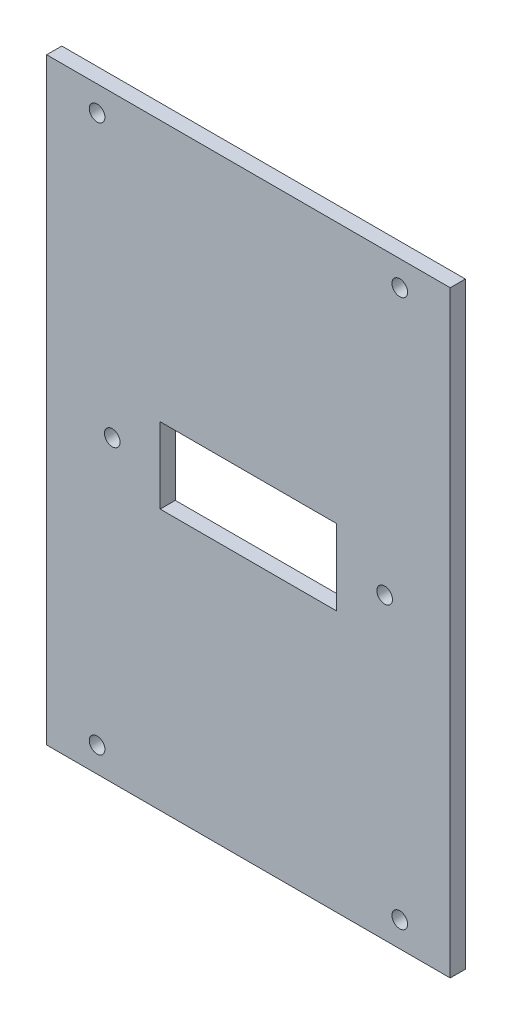
ISO-10303-21;
HEADER;
FILE_DESCRIPTION(('STEP AP214'),'2;1');
FILE_NAME('part.step','',(''),(''),'','','');
FILE_SCHEMA(('AUTOMOTIVE_DESIGN { 1 0 10303 214 1 1 1 1 }'));
ENDSEC;
DATA;
#1=APPLICATION_CONTEXT('core data for automotive mechanical design processes');
#2=APPLICATION_PROTOCOL_DEFINITION('international standard','automotive_design',2000,#1);
#3=PRODUCT_CONTEXT('',#1,'mechanical');
#4=PRODUCT('Part','Part','',(#3));
#5=PRODUCT_RELATED_PRODUCT_CATEGORY('part','',(#4));
#6=PRODUCT_DEFINITION_FORMATION('','',#4);
#7=PRODUCT_DEFINITION_CONTEXT('part definition',#1,'design');
#8=PRODUCT_DEFINITION('design','',#6,#7);
#9=PRODUCT_DEFINITION_SHAPE('','',#8);
#10=(LENGTH_UNIT() NAMED_UNIT(*) SI_UNIT(.MILLI.,.METRE.));
#11=(NAMED_UNIT(*) PLANE_ANGLE_UNIT() SI_UNIT($,.RADIAN.));
#12=(NAMED_UNIT(*) SI_UNIT($,.STERADIAN.) SOLID_ANGLE_UNIT());
#13=UNCERTAINTY_MEASURE_WITH_UNIT(LENGTH_MEASURE(1.E-05),#10,'distance_accuracy_value','');
#14=(GEOMETRIC_REPRESENTATION_CONTEXT(3) GLOBAL_UNCERTAINTY_ASSIGNED_CONTEXT((#13)) GLOBAL_UNIT_ASSIGNED_CONTEXT((#10,
#11,#12)) REPRESENTATION_CONTEXT('',''));
#15=CARTESIAN_POINT('',(0.,0.,0.));
#16=DIRECTION('',(0.,0.,1.));
#17=DIRECTION('',(1.,0.,0.));
#18=AXIS2_PLACEMENT_3D('',#15,#16,#17);
#19=CARTESIAN_POINT('',(0.,0.,3.));
#20=DIRECTION('',(0.,0.,-1.));
#21=DIRECTION('',(-1.,0.,0.));
#22=AXIS2_PLACEMENT_3D('',#19,#20,#21);
#23=PLANE('',#22);
#24=CARTESIAN_POINT('',(66.9999999999992,59.25,3.));
#25=DIRECTION('',(0.,0.,-1.));
#26=DIRECTION('',(-1.,0.,0.));
#27=AXIS2_PLACEMENT_3D('',#24,#25,#26);
#28=CIRCLE('',#27,1.55000000000001);
#29=CARTESIAN_POINT('',(65.4499999999992,59.25,3.));
#30=VERTEX_POINT('',#29);
#31=EDGE_CURVE('E253',#30,#30,#28,.F.);
#32=ORIENTED_EDGE('',*,*,#31,.F.);
#33=EDGE_LOOP('',(#32));
#34=FACE_BOUND('',#33,.T.);
#35=CARTESIAN_POINT('',(13.0000000000007,59.25,3.));
#36=DIRECTION('',(0.,0.,-1.));
#37=DIRECTION('',(-1.,0.,0.));
#38=AXIS2_PLACEMENT_3D('',#35,#36,#37);
#39=CIRCLE('',#38,1.55000000000001);
#40=CARTESIAN_POINT('',(11.4500000000007,59.25,3.));
#41=VERTEX_POINT('',#40);
#42=EDGE_CURVE('E262',#41,#41,#39,.F.);
#43=ORIENTED_EDGE('',*,*,#42,.F.);
#44=EDGE_LOOP('',(#43));
#45=FACE_BOUND('',#44,.T.);
#46=CARTESIAN_POINT('',(70.,4.99999999999998,3.));
#47=DIRECTION('',(0.,0.,1.));
#48=DIRECTION('',(1.,0.,0.));
#49=AXIS2_PLACEMENT_3D('',#46,#47,#48);
#50=CIRCLE('',#49,1.54999999999999);
#51=CARTESIAN_POINT('',(71.55,4.99999999999998,3.));
#52=VERTEX_POINT('',#51);
#53=EDGE_CURVE('E277',#52,#52,#50,.T.);
#54=ORIENTED_EDGE('',*,*,#53,.F.);
#55=EDGE_LOOP('',(#54));
#56=FACE_BOUND('',#55,.T.);
#57=CARTESIAN_POINT('',(9.99999999999997,113.5,3.));
#58=DIRECTION('',(0.,0.,1.));
#59=DIRECTION('',(1.,0.,0.));
#60=AXIS2_PLACEMENT_3D('',#57,#58,#59);
#61=CIRCLE('',#60,1.54999999999999);
#62=CARTESIAN_POINT('',(11.55,113.5,3.));
#63=VERTEX_POINT('',#62);
#64=EDGE_CURVE('E133',#63,#63,#61,.T.);
#65=ORIENTED_EDGE('',*,*,#64,.F.);
#66=EDGE_LOOP('',(#65));
#67=FACE_BOUND('',#66,.T.);
#68=DIRECTION('',(0.,-1.,0.));
#69=VECTOR('',#68,1.);
#70=CARTESIAN_POINT('',(0.,0.,3.));
#71=LINE('',#70,#69);
#72=CARTESIAN_POINT('',(0.,118.5,3.));
#73=VERTEX_POINT('',#72);
#74=CARTESIAN_POINT('',(0.,0.,3.));
#75=VERTEX_POINT('',#74);
#76=EDGE_CURVE('E143',#73,#75,#71,.T.);
#77=ORIENTED_EDGE('',*,*,#76,.T.);
#78=DIRECTION('',(1.,0.,0.));
#79=VECTOR('',#78,1.);
#80=CARTESIAN_POINT('',(0.,0.,3.));
#81=LINE('',#80,#79);
#82=CARTESIAN_POINT('',(80.,0.,3.));
#83=VERTEX_POINT('',#82);
#84=EDGE_CURVE('E146',#75,#83,#81,.T.);
#85=ORIENTED_EDGE('',*,*,#84,.T.);
#86=DIRECTION('',(0.,1.,0.));
#87=VECTOR('',#86,1.);
#88=CARTESIAN_POINT('',(80.,0.,3.));
#89=LINE('',#88,#87);
#90=CARTESIAN_POINT('',(80.,118.5,3.));
#91=VERTEX_POINT('',#90);
#92=EDGE_CURVE('E149',#83,#91,#89,.T.);
#93=ORIENTED_EDGE('',*,*,#92,.T.);
#94=DIRECTION('',(-1.,0.,0.));
#95=VECTOR('',#94,1.);
#96=CARTESIAN_POINT('',(0.,118.5,3.));
#97=LINE('',#96,#95);
#98=EDGE_CURVE('E151',#91,#73,#97,.T.);
#99=ORIENTED_EDGE('',*,*,#98,.T.);
#100=EDGE_LOOP('',(#77,#85,#93,#99));
#101=FACE_BOUND('',#100,.T.);
#102=DIRECTION('',(0.,1.,0.));
#103=VECTOR('',#102,1.);
#104=CARTESIAN_POINT('',(57.5,66.75,3.));
#105=LINE('',#104,#103);
#106=CARTESIAN_POINT('',(57.5,51.75,3.));
#107=VERTEX_POINT('',#106);
#108=CARTESIAN_POINT('',(57.5,66.75,3.));
#109=VERTEX_POINT('',#108);
#110=EDGE_CURVE('E104',#107,#109,#105,.T.);
#111=ORIENTED_EDGE('',*,*,#110,.F.);
#112=DIRECTION('',(1.,0.,0.));
#113=VECTOR('',#112,1.);
#114=CARTESIAN_POINT('',(22.5,51.75,3.));
#115=LINE('',#114,#113);
#116=CARTESIAN_POINT('',(22.5,51.75,3.));
#117=VERTEX_POINT('',#116);
#118=EDGE_CURVE('E127',#117,#107,#115,.T.);
#119=ORIENTED_EDGE('',*,*,#118,.F.);
#120=DIRECTION('',(0.,-1.,0.));
#121=VECTOR('',#120,1.);
#122=CARTESIAN_POINT('',(22.5,66.75,3.));
#123=LINE('',#122,#121);
#124=CARTESIAN_POINT('',(22.5,66.75,3.));
#125=VERTEX_POINT('',#124);
#126=EDGE_CURVE('E125',#125,#117,#123,.T.);
#127=ORIENTED_EDGE('',*,*,#126,.F.);
#128=DIRECTION('',(-1.,0.,0.));
#129=VECTOR('',#128,1.);
#130=CARTESIAN_POINT('',(22.5,66.75,3.));
#131=LINE('',#130,#129);
#132=EDGE_CURVE('E112',#109,#125,#131,.T.);
#133=ORIENTED_EDGE('',*,*,#132,.F.);
#134=EDGE_LOOP('',(#111,#119,#127,#133));
#135=FACE_BOUND('',#134,.T.);
#136=CARTESIAN_POINT('',(70.,113.5,3.));
#137=DIRECTION('',(0.,0.,-1.));
#138=DIRECTION('',(-1.,0.,0.));
#139=AXIS2_PLACEMENT_3D('',#136,#137,#138);
#140=CIRCLE('',#139,1.54999999999999);
#141=CARTESIAN_POINT('',(71.55,113.5,3.));
#142=VERTEX_POINT('',#141);
#143=EDGE_CURVE('E270',#142,#142,#140,.T.);
#144=ORIENTED_EDGE('',*,*,#143,.T.);
#145=EDGE_LOOP('',(#144));
#146=FACE_BOUND('',#145,.T.);
#147=CARTESIAN_POINT('',(9.99999999999997,4.99999999999998,3.));
#148=DIRECTION('',(0.,0.,-1.));
#149=DIRECTION('',(-1.,0.,0.));
#150=AXIS2_PLACEMENT_3D('',#147,#148,#149);
#151=CIRCLE('',#150,1.55);
#152=CARTESIAN_POINT('',(11.55,4.99999999999998,3.));
#153=VERTEX_POINT('',#152);
#154=EDGE_CURVE('E257',#153,#153,#151,.T.);
#155=ORIENTED_EDGE('',*,*,#154,.T.);
#156=EDGE_LOOP('',(#155));
#157=FACE_BOUND('',#156,.T.);
#158=ADVANCED_FACE('F39',(#34,#45,#56,#67,#101,#135,#146,#157),#23,.F.);
#159=CARTESIAN_POINT('',(0.,0.,0.));
#160=DIRECTION('',(0.,0.,-1.));
#161=DIRECTION('',(-1.,0.,0.));
#162=AXIS2_PLACEMENT_3D('',#159,#160,#161);
#163=PLANE('',#162);
#164=CARTESIAN_POINT('',(66.9999999999992,59.25,0.));
#165=DIRECTION('',(0.,0.,-1.));
#166=DIRECTION('',(-1.,0.,0.));
#167=AXIS2_PLACEMENT_3D('',#164,#165,#166);
#168=CIRCLE('',#167,1.55000000000001);
#169=CARTESIAN_POINT('',(65.4499999999992,59.25,0.));
#170=VERTEX_POINT('',#169);
#171=EDGE_CURVE('E251',#170,#170,#168,.T.);
#172=ORIENTED_EDGE('',*,*,#171,.F.);
#173=EDGE_LOOP('',(#172));
#174=FACE_BOUND('',#173,.T.);
#175=CARTESIAN_POINT('',(13.0000000000007,59.25,0.));
#176=DIRECTION('',(0.,0.,-1.));
#177=DIRECTION('',(1.,0.,0.));
#178=AXIS2_PLACEMENT_3D('',#175,#176,#177);
#179=CIRCLE('',#178,1.55000000000001);
#180=CARTESIAN_POINT('',(11.4500000000007,59.25,0.));
#181=VERTEX_POINT('',#180);
#182=EDGE_CURVE('E259',#181,#181,#179,.T.);
#183=ORIENTED_EDGE('',*,*,#182,.F.);
#184=EDGE_LOOP('',(#183));
#185=FACE_BOUND('',#184,.T.);
#186=CARTESIAN_POINT('',(70.,113.5,0.));
#187=DIRECTION('',(0.,0.,-1.));
#188=DIRECTION('',(-1.,0.,0.));
#189=AXIS2_PLACEMENT_3D('',#186,#187,#188);
#190=CIRCLE('',#189,1.54999999999999);
#191=CARTESIAN_POINT('',(71.55,113.5,0.));
#192=VERTEX_POINT('',#191);
#193=EDGE_CURVE('E267',#192,#192,#190,.T.);
#194=ORIENTED_EDGE('',*,*,#193,.F.);
#195=EDGE_LOOP('',(#194));
#196=FACE_BOUND('',#195,.T.);
#197=CARTESIAN_POINT('',(9.99999999999997,113.5,0.));
#198=DIRECTION('',(0.,0.,-1.));
#199=DIRECTION('',(-1.,0.,0.));
#200=AXIS2_PLACEMENT_3D('',#197,#198,#199);
#201=CIRCLE('',#200,1.54999999999999);
#202=CARTESIAN_POINT('',(11.55,113.5,0.));
#203=VERTEX_POINT('',#202);
#204=EDGE_CURVE('E274',#203,#203,#201,.F.);
#205=ORIENTED_EDGE('',*,*,#204,.T.);
#206=EDGE_LOOP('',(#205));
#207=FACE_BOUND('',#206,.T.);
#208=DIRECTION('',(0.,-1.,0.));
#209=VECTOR('',#208,1.);
#210=CARTESIAN_POINT('',(0.,0.,0.));
#211=LINE('',#210,#209);
#212=CARTESIAN_POINT('',(0.,118.5,0.));
#213=VERTEX_POINT('',#212);
#214=CARTESIAN_POINT('',(0.,0.,0.));
#215=VERTEX_POINT('',#214);
#216=EDGE_CURVE('E120',#213,#215,#211,.T.);
#217=ORIENTED_EDGE('',*,*,#216,.F.);
#218=DIRECTION('',(-1.,0.,0.));
#219=VECTOR('',#218,1.);
#220=CARTESIAN_POINT('',(0.,118.5,0.));
#221=LINE('',#220,#219);
#222=CARTESIAN_POINT('',(80.,118.5,0.));
#223=VERTEX_POINT('',#222);
#224=EDGE_CURVE('E147',#223,#213,#221,.T.);
#225=ORIENTED_EDGE('',*,*,#224,.F.);
#226=DIRECTION('',(0.,1.,0.));
#227=VECTOR('',#226,1.);
#228=CARTESIAN_POINT('',(80.,0.,0.));
#229=LINE('',#228,#227);
#230=CARTESIAN_POINT('',(80.,0.,0.));
#231=VERTEX_POINT('',#230);
#232=EDGE_CURVE('E158',#231,#223,#229,.T.);
#233=ORIENTED_EDGE('',*,*,#232,.F.);
#234=DIRECTION('',(1.,0.,0.));
#235=VECTOR('',#234,1.);
#236=CARTESIAN_POINT('',(0.,0.,0.));
#237=LINE('',#236,#235);
#238=EDGE_CURVE('E156',#215,#231,#237,.T.);
#239=ORIENTED_EDGE('',*,*,#238,.F.);
#240=EDGE_LOOP('',(#217,#225,#233,#239));
#241=FACE_BOUND('',#240,.T.);
#242=DIRECTION('',(1.,0.,0.));
#243=VECTOR('',#242,1.);
#244=CARTESIAN_POINT('',(22.5,51.75,0.));
#245=LINE('',#244,#243);
#246=CARTESIAN_POINT('',(22.5,51.75,0.));
#247=VERTEX_POINT('',#246);
#248=CARTESIAN_POINT('',(57.5,51.75,0.));
#249=VERTEX_POINT('',#248);
#250=EDGE_CURVE('E113',#247,#249,#245,.T.);
#251=ORIENTED_EDGE('',*,*,#250,.T.);
#252=DIRECTION('',(0.,1.,0.));
#253=VECTOR('',#252,1.);
#254=CARTESIAN_POINT('',(57.5,66.75,0.));
#255=LINE('',#254,#253);
#256=CARTESIAN_POINT('',(57.5,66.75,0.));
#257=VERTEX_POINT('',#256);
#258=EDGE_CURVE('E62',#249,#257,#255,.T.);
#259=ORIENTED_EDGE('',*,*,#258,.T.);
#260=DIRECTION('',(-1.,0.,0.));
#261=VECTOR('',#260,1.);
#262=CARTESIAN_POINT('',(22.5,66.75,0.));
#263=LINE('',#262,#261);
#264=CARTESIAN_POINT('',(22.5,66.75,0.));
#265=VERTEX_POINT('',#264);
#266=EDGE_CURVE('E119',#257,#265,#263,.T.);
#267=ORIENTED_EDGE('',*,*,#266,.T.);
#268=DIRECTION('',(0.,-1.,0.));
#269=VECTOR('',#268,1.);
#270=CARTESIAN_POINT('',(22.5,66.75,0.));
#271=LINE('',#270,#269);
#272=EDGE_CURVE('E135',#265,#247,#271,.T.);
#273=ORIENTED_EDGE('',*,*,#272,.T.);
#274=EDGE_LOOP('',(#251,#259,#267,#273));
#275=FACE_BOUND('',#274,.T.);
#276=CARTESIAN_POINT('',(70.,4.99999999999998,0.));
#277=DIRECTION('',(0.,0.,-1.));
#278=DIRECTION('',(-1.,0.,0.));
#279=AXIS2_PLACEMENT_3D('',#276,#277,#278);
#280=CIRCLE('',#279,1.54999999999999);
#281=CARTESIAN_POINT('',(71.55,4.99999999999998,0.));
#282=VERTEX_POINT('',#281);
#283=EDGE_CURVE('E271',#282,#282,#280,.F.);
#284=ORIENTED_EDGE('',*,*,#283,.T.);
#285=EDGE_LOOP('',(#284));
#286=FACE_BOUND('',#285,.T.);
#287=CARTESIAN_POINT('',(9.99999999999997,4.99999999999998,0.));
#288=DIRECTION('',(0.,0.,-1.));
#289=DIRECTION('',(-1.,0.,0.));
#290=AXIS2_PLACEMENT_3D('',#287,#288,#289);
#291=CIRCLE('',#290,1.55);
#292=CARTESIAN_POINT('',(11.55,4.99999999999998,0.));
#293=VERTEX_POINT('',#292);
#294=EDGE_CURVE('E254',#293,#293,#291,.T.);
#295=ORIENTED_EDGE('',*,*,#294,.F.);
#296=EDGE_LOOP('',(#295));
#297=FACE_BOUND('',#296,.T.);
#298=ADVANCED_FACE('F176',(#174,#185,#196,#207,#241,#275,#286,#297),#163,.T.);
#299=CARTESIAN_POINT('',(0.,0.,3.));
#300=DIRECTION('',(1.,0.,0.));
#301=DIRECTION('',(0.,1.,0.));
#302=AXIS2_PLACEMENT_3D('',#299,#300,#301);
#303=PLANE('',#302);
#304=ORIENTED_EDGE('',*,*,#216,.T.);
#305=DIRECTION('',(0.,0.,-1.));
#306=VECTOR('',#305,1.);
#307=CARTESIAN_POINT('',(0.,0.,3.));
#308=LINE('',#307,#306);
#309=EDGE_CURVE('E11',#75,#215,#308,.T.);
#310=ORIENTED_EDGE('',*,*,#309,.F.);
#311=ORIENTED_EDGE('',*,*,#76,.F.);
#312=DIRECTION('',(0.,0.,-1.));
#313=VECTOR('',#312,1.);
#314=CARTESIAN_POINT('',(0.,118.5,3.));
#315=LINE('',#314,#313);
#316=EDGE_CURVE('E153',#73,#213,#315,.T.);
#317=ORIENTED_EDGE('',*,*,#316,.T.);
#318=EDGE_LOOP('',(#304,#310,#311,#317));
#319=FACE_BOUND('',#318,.T.);
#320=ADVANCED_FACE('F41',(#319),#303,.F.);
#321=CARTESIAN_POINT('',(0.,0.,3.));
#322=DIRECTION('',(0.,1.,0.));
#323=DIRECTION('',(-1.,0.,0.));
#324=AXIS2_PLACEMENT_3D('',#321,#322,#323);
#325=PLANE('',#324);
#326=ORIENTED_EDGE('',*,*,#238,.T.);
#327=DIRECTION('',(0.,0.,-1.));
#328=VECTOR('',#327,1.);
#329=CARTESIAN_POINT('',(80.,0.,3.));
#330=LINE('',#329,#328);
#331=EDGE_CURVE('E47',#83,#231,#330,.T.);
#332=ORIENTED_EDGE('',*,*,#331,.F.);
#333=ORIENTED_EDGE('',*,*,#84,.F.);
#334=ORIENTED_EDGE('',*,*,#309,.T.);
#335=EDGE_LOOP('',(#326,#332,#333,#334));
#336=FACE_BOUND('',#335,.T.);
#337=ADVANCED_FACE('F186',(#336),#325,.F.);
#338=CARTESIAN_POINT('',(80.,0.,3.));
#339=DIRECTION('',(-1.,0.,0.));
#340=DIRECTION('',(0.,-1.,0.));
#341=AXIS2_PLACEMENT_3D('',#338,#339,#340);
#342=PLANE('',#341);
#343=ORIENTED_EDGE('',*,*,#232,.T.);
#344=DIRECTION('',(0.,0.,-1.));
#345=VECTOR('',#344,1.);
#346=CARTESIAN_POINT('',(80.,118.5,3.));
#347=LINE('',#346,#345);
#348=EDGE_CURVE('E163',#91,#223,#347,.T.);
#349=ORIENTED_EDGE('',*,*,#348,.F.);
#350=ORIENTED_EDGE('',*,*,#92,.F.);
#351=ORIENTED_EDGE('',*,*,#331,.T.);
#352=EDGE_LOOP('',(#343,#349,#350,#351));
#353=FACE_BOUND('',#352,.T.);
#354=ADVANCED_FACE('F170',(#353),#342,.F.);
#355=CARTESIAN_POINT('',(0.,118.5,3.));
#356=DIRECTION('',(0.,-1.,0.));
#357=DIRECTION('',(1.,0.,0.));
#358=AXIS2_PLACEMENT_3D('',#355,#356,#357);
#359=PLANE('',#358);
#360=ORIENTED_EDGE('',*,*,#224,.T.);
#361=ORIENTED_EDGE('',*,*,#316,.F.);
#362=ORIENTED_EDGE('',*,*,#98,.F.);
#363=ORIENTED_EDGE('',*,*,#348,.T.);
#364=EDGE_LOOP('',(#360,#361,#362,#363));
#365=FACE_BOUND('',#364,.T.);
#366=ADVANCED_FACE('F180',(#365),#359,.F.);
#367=CARTESIAN_POINT('',(57.5,66.75,3.));
#368=DIRECTION('',(-1.,0.,0.));
#369=DIRECTION('',(0.,0.,1.));
#370=AXIS2_PLACEMENT_3D('',#367,#368,#369);
#371=PLANE('',#370);
#372=ORIENTED_EDGE('',*,*,#258,.F.);
#373=DIRECTION('',(0.,0.,-1.));
#374=VECTOR('',#373,1.);
#375=CARTESIAN_POINT('',(57.5,51.75,3.));
#376=LINE('',#375,#374);
#377=EDGE_CURVE('E108',#107,#249,#376,.T.);
#378=ORIENTED_EDGE('',*,*,#377,.F.);
#379=ORIENTED_EDGE('',*,*,#110,.T.);
#380=DIRECTION('',(0.,0.,-1.));
#381=VECTOR('',#380,1.);
#382=CARTESIAN_POINT('',(57.5,66.75,3.));
#383=LINE('',#382,#381);
#384=EDGE_CURVE('E107',#109,#257,#383,.T.);
#385=ORIENTED_EDGE('',*,*,#384,.T.);
#386=EDGE_LOOP('',(#372,#378,#379,#385));
#387=FACE_BOUND('',#386,.T.);
#388=ADVANCED_FACE('F106',(#387),#371,.T.);
#389=CARTESIAN_POINT('',(22.5,66.75,3.));
#390=DIRECTION('',(0.,-1.,0.));
#391=DIRECTION('',(0.,0.,-1.));
#392=AXIS2_PLACEMENT_3D('',#389,#390,#391);
#393=PLANE('',#392);
#394=ORIENTED_EDGE('',*,*,#266,.F.);
#395=ORIENTED_EDGE('',*,*,#384,.F.);
#396=ORIENTED_EDGE('',*,*,#132,.T.);
#397=DIRECTION('',(0.,0.,-1.));
#398=VECTOR('',#397,1.);
#399=CARTESIAN_POINT('',(22.5,66.75,3.));
#400=LINE('',#399,#398);
#401=EDGE_CURVE('E121',#125,#265,#400,.T.);
#402=ORIENTED_EDGE('',*,*,#401,.T.);
#403=EDGE_LOOP('',(#394,#395,#396,#402));
#404=FACE_BOUND('',#403,.T.);
#405=ADVANCED_FACE('F116',(#404),#393,.T.);
#406=CARTESIAN_POINT('',(22.5,66.75,3.));
#407=DIRECTION('',(1.,0.,0.));
#408=DIRECTION('',(0.,1.,0.));
#409=AXIS2_PLACEMENT_3D('',#406,#407,#408);
#410=PLANE('',#409);
#411=ORIENTED_EDGE('',*,*,#272,.F.);
#412=ORIENTED_EDGE('',*,*,#401,.F.);
#413=ORIENTED_EDGE('',*,*,#126,.T.);
#414=DIRECTION('',(0.,0.,-1.));
#415=VECTOR('',#414,1.);
#416=CARTESIAN_POINT('',(22.5,51.75,3.));
#417=LINE('',#416,#415);
#418=EDGE_CURVE('E54',#117,#247,#417,.T.);
#419=ORIENTED_EDGE('',*,*,#418,.T.);
#420=EDGE_LOOP('',(#411,#412,#413,#419));
#421=FACE_BOUND('',#420,.T.);
#422=ADVANCED_FACE('F213',(#421),#410,.T.);
#423=CARTESIAN_POINT('',(22.5,51.75,3.));
#424=DIRECTION('',(0.,1.,0.));
#425=DIRECTION('',(0.,0.,1.));
#426=AXIS2_PLACEMENT_3D('',#423,#424,#425);
#427=PLANE('',#426);
#428=ORIENTED_EDGE('',*,*,#250,.F.);
#429=ORIENTED_EDGE('',*,*,#418,.F.);
#430=ORIENTED_EDGE('',*,*,#118,.T.);
#431=ORIENTED_EDGE('',*,*,#377,.T.);
#432=EDGE_LOOP('',(#428,#429,#430,#431));
#433=FACE_BOUND('',#432,.T.);
#434=ADVANCED_FACE('F217',(#433),#427,.T.);
#435=CARTESIAN_POINT('',(9.99999999999997,113.5,-0.00100000000000013));
#436=DIRECTION('',(0.,0.,1.));
#437=DIRECTION('',(1.,0.,0.));
#438=AXIS2_PLACEMENT_3D('',#435,#436,#437);
#439=CYLINDRICAL_SURFACE('',#438,1.54999999999999);
#440=CARTESIAN_POINT('',(11.55,113.5,0.));
#441=CARTESIAN_POINT('',(11.55,113.5,0.03125));
#442=CARTESIAN_POINT('',(11.55,113.5,0.0625));
#443=CARTESIAN_POINT('',(11.55,113.5,0.125));
#444=CARTESIAN_POINT('',(11.55,113.5,0.15625));
#445=CARTESIAN_POINT('',(11.55,113.5,0.21875));
#446=CARTESIAN_POINT('',(11.55,113.5,0.25));
#447=CARTESIAN_POINT('',(11.55,113.5,0.3125));
#448=CARTESIAN_POINT('',(11.55,113.5,0.34375));
#449=CARTESIAN_POINT('',(11.55,113.5,0.40625));
#450=CARTESIAN_POINT('',(11.55,113.5,0.4375));
#451=CARTESIAN_POINT('',(11.55,113.5,0.5));
#452=CARTESIAN_POINT('',(11.55,113.5,0.53125));
#453=CARTESIAN_POINT('',(11.55,113.5,0.59375));
#454=CARTESIAN_POINT('',(11.55,113.5,0.625));
#455=CARTESIAN_POINT('',(11.55,113.5,0.6875));
#456=CARTESIAN_POINT('',(11.55,113.5,0.71875));
#457=CARTESIAN_POINT('',(11.55,113.5,0.78125));
#458=CARTESIAN_POINT('',(11.55,113.5,0.8125));
#459=CARTESIAN_POINT('',(11.55,113.5,0.875));
#460=CARTESIAN_POINT('',(11.55,113.5,0.90625));
#461=CARTESIAN_POINT('',(11.55,113.5,0.96875));
#462=CARTESIAN_POINT('',(11.55,113.5,1.));
#463=CARTESIAN_POINT('',(11.55,113.5,1.0625));
#464=CARTESIAN_POINT('',(11.55,113.5,1.09375));
#465=CARTESIAN_POINT('',(11.55,113.5,1.15625));
#466=CARTESIAN_POINT('',(11.55,113.5,1.1875));
#467=CARTESIAN_POINT('',(11.55,113.5,1.25));
#468=CARTESIAN_POINT('',(11.55,113.5,1.28125));
#469=CARTESIAN_POINT('',(11.55,113.5,1.34375));
#470=CARTESIAN_POINT('',(11.55,113.5,1.375));
#471=CARTESIAN_POINT('',(11.55,113.5,1.4375));
#472=CARTESIAN_POINT('',(11.55,113.5,1.46875));
#473=CARTESIAN_POINT('',(11.55,113.5,1.53125));
#474=CARTESIAN_POINT('',(11.55,113.5,1.5625));
#475=CARTESIAN_POINT('',(11.55,113.5,1.625));
#476=CARTESIAN_POINT('',(11.55,113.5,1.65625));
#477=CARTESIAN_POINT('',(11.55,113.5,1.71875));
#478=CARTESIAN_POINT('',(11.55,113.5,1.75));
#479=CARTESIAN_POINT('',(11.55,113.5,1.8125));
#480=CARTESIAN_POINT('',(11.55,113.5,1.84375));
#481=CARTESIAN_POINT('',(11.55,113.5,1.90625));
#482=CARTESIAN_POINT('',(11.55,113.5,1.9375));
#483=CARTESIAN_POINT('',(11.55,113.5,2.));
#484=CARTESIAN_POINT('',(11.55,113.5,2.03125));
#485=CARTESIAN_POINT('',(11.55,113.5,2.09375));
#486=CARTESIAN_POINT('',(11.55,113.5,2.125));
#487=CARTESIAN_POINT('',(11.55,113.5,2.1875));
#488=CARTESIAN_POINT('',(11.55,113.5,2.21875));
#489=CARTESIAN_POINT('',(11.55,113.5,2.28125));
#490=CARTESIAN_POINT('',(11.55,113.5,2.3125));
#491=CARTESIAN_POINT('',(11.55,113.5,2.375));
#492=CARTESIAN_POINT('',(11.55,113.5,2.40625));
#493=CARTESIAN_POINT('',(11.55,113.5,2.46875));
#494=CARTESIAN_POINT('',(11.55,113.5,2.5));
#495=CARTESIAN_POINT('',(11.55,113.5,2.5625));
#496=CARTESIAN_POINT('',(11.55,113.5,2.59375));
#497=CARTESIAN_POINT('',(11.55,113.5,2.65625));
#498=CARTESIAN_POINT('',(11.55,113.5,2.6875));
#499=CARTESIAN_POINT('',(11.55,113.5,2.75));
#500=CARTESIAN_POINT('',(11.55,113.5,2.78125));
#501=CARTESIAN_POINT('',(11.55,113.5,2.84375));
#502=CARTESIAN_POINT('',(11.55,113.5,2.875));
#503=CARTESIAN_POINT('',(11.55,113.5,2.9375));
#504=CARTESIAN_POINT('',(11.55,113.5,2.96875));
#505=CARTESIAN_POINT('',(11.55,113.5,3.));
#506=B_SPLINE_CURVE_WITH_KNOTS('',3,(#440,#441,#442,#443,#444,#445,#446,#447,#448,#449,#450,
#451,#452,#453,#454,#455,#456,#457,#458,#459,#460,#461,#462,#463,#464,#465,#466,#467,#468,#469,
#470,#471,#472,#473,#474,#475,#476,#477,#478,#479,#480,#481,#482,#483,#484,#485,#486,#487,#488,
#489,#490,#491,#492,#493,#494,#495,#496,#497,#498,#499,#500,#501,#502,#503,#504,#505),
.UNSPECIFIED.,.F.,.F.,(4,2,2,2,2,2,2,2,2,2,2,2,2,2,2,2,2,2,2,2,2,2,2,2,2,2,2,2,2,2,2,2,4),(0.,
0.09375,0.1875,0.28125,0.375,0.46875,0.5625,0.65625,0.75,0.84375,0.9375,1.03125,1.125,1.21875,
1.3125,1.40625,1.5,1.59375,1.6875,1.78125,1.875,1.96875,2.0625,2.15625,2.25,2.34375,2.4375,
2.53125,2.625,2.71875,2.8125,2.90625,3.),.UNSPECIFIED.);
#507=EDGE_CURVE('BSEAM223',#203,#63,#506,.T.);
#508=ORIENTED_EDGE('',*,*,#204,.F.);
#509=ORIENTED_EDGE('',*,*,#64,.T.);
#510=ORIENTED_EDGE('',*,*,#507,.T.);
#511=ORIENTED_EDGE('',*,*,#507,.F.);
#512=EDGE_LOOP('',(#508,#510,#509,#511));
#513=FACE_BOUND('',#512,.T.);
#514=ADVANCED_FACE('F223',(#513),#439,.F.);
#515=CARTESIAN_POINT('',(70.,113.5,-0.00100000000000013));
#516=DIRECTION('',(0.,0.,1.));
#517=DIRECTION('',(1.,0.,0.));
#518=AXIS2_PLACEMENT_3D('',#515,#516,#517);
#519=CYLINDRICAL_SURFACE('',#518,1.54999999999999);
#520=CARTESIAN_POINT('',(71.55,113.5,0.));
#521=CARTESIAN_POINT('',(71.55,113.5,0.03125));
#522=CARTESIAN_POINT('',(71.55,113.5,0.0625));
#523=CARTESIAN_POINT('',(71.55,113.5,0.125));
#524=CARTESIAN_POINT('',(71.55,113.5,0.15625));
#525=CARTESIAN_POINT('',(71.55,113.5,0.21875));
#526=CARTESIAN_POINT('',(71.55,113.5,0.25));
#527=CARTESIAN_POINT('',(71.55,113.5,0.3125));
#528=CARTESIAN_POINT('',(71.55,113.5,0.34375));
#529=CARTESIAN_POINT('',(71.55,113.5,0.40625));
#530=CARTESIAN_POINT('',(71.55,113.5,0.4375));
#531=CARTESIAN_POINT('',(71.55,113.5,0.5));
#532=CARTESIAN_POINT('',(71.55,113.5,0.53125));
#533=CARTESIAN_POINT('',(71.55,113.5,0.59375));
#534=CARTESIAN_POINT('',(71.55,113.5,0.625));
#535=CARTESIAN_POINT('',(71.55,113.5,0.6875));
#536=CARTESIAN_POINT('',(71.55,113.5,0.71875));
#537=CARTESIAN_POINT('',(71.55,113.5,0.78125));
#538=CARTESIAN_POINT('',(71.55,113.5,0.8125));
#539=CARTESIAN_POINT('',(71.55,113.5,0.875));
#540=CARTESIAN_POINT('',(71.55,113.5,0.90625));
#541=CARTESIAN_POINT('',(71.55,113.5,0.96875));
#542=CARTESIAN_POINT('',(71.55,113.5,1.));
#543=CARTESIAN_POINT('',(71.55,113.5,1.0625));
#544=CARTESIAN_POINT('',(71.55,113.5,1.09375));
#545=CARTESIAN_POINT('',(71.55,113.5,1.15625));
#546=CARTESIAN_POINT('',(71.55,113.5,1.1875));
#547=CARTESIAN_POINT('',(71.55,113.5,1.25));
#548=CARTESIAN_POINT('',(71.55,113.5,1.28125));
#549=CARTESIAN_POINT('',(71.55,113.5,1.34375));
#550=CARTESIAN_POINT('',(71.55,113.5,1.375));
#551=CARTESIAN_POINT('',(71.55,113.5,1.4375));
#552=CARTESIAN_POINT('',(71.55,113.5,1.46875));
#553=CARTESIAN_POINT('',(71.55,113.5,1.53125));
#554=CARTESIAN_POINT('',(71.55,113.5,1.5625));
#555=CARTESIAN_POINT('',(71.55,113.5,1.625));
#556=CARTESIAN_POINT('',(71.55,113.5,1.65625));
#557=CARTESIAN_POINT('',(71.55,113.5,1.71875));
#558=CARTESIAN_POINT('',(71.55,113.5,1.75));
#559=CARTESIAN_POINT('',(71.55,113.5,1.8125));
#560=CARTESIAN_POINT('',(71.55,113.5,1.84375));
#561=CARTESIAN_POINT('',(71.55,113.5,1.90625));
#562=CARTESIAN_POINT('',(71.55,113.5,1.9375));
#563=CARTESIAN_POINT('',(71.55,113.5,2.));
#564=CARTESIAN_POINT('',(71.55,113.5,2.03125));
#565=CARTESIAN_POINT('',(71.55,113.5,2.09375));
#566=CARTESIAN_POINT('',(71.55,113.5,2.125));
#567=CARTESIAN_POINT('',(71.55,113.5,2.1875));
#568=CARTESIAN_POINT('',(71.55,113.5,2.21875));
#569=CARTESIAN_POINT('',(71.55,113.5,2.28125));
#570=CARTESIAN_POINT('',(71.55,113.5,2.3125));
#571=CARTESIAN_POINT('',(71.55,113.5,2.375));
#572=CARTESIAN_POINT('',(71.55,113.5,2.40625));
#573=CARTESIAN_POINT('',(71.55,113.5,2.46875));
#574=CARTESIAN_POINT('',(71.55,113.5,2.5));
#575=CARTESIAN_POINT('',(71.55,113.5,2.5625));
#576=CARTESIAN_POINT('',(71.55,113.5,2.59375));
#577=CARTESIAN_POINT('',(71.55,113.5,2.65625));
#578=CARTESIAN_POINT('',(71.55,113.5,2.6875));
#579=CARTESIAN_POINT('',(71.55,113.5,2.75));
#580=CARTESIAN_POINT('',(71.55,113.5,2.78125));
#581=CARTESIAN_POINT('',(71.55,113.5,2.84375));
#582=CARTESIAN_POINT('',(71.55,113.5,2.875));
#583=CARTESIAN_POINT('',(71.55,113.5,2.9375));
#584=CARTESIAN_POINT('',(71.55,113.5,2.96875));
#585=CARTESIAN_POINT('',(71.55,113.5,3.));
#586=B_SPLINE_CURVE_WITH_KNOTS('',3,(#520,#521,#522,#523,#524,#525,#526,#527,#528,#529,#530,
#531,#532,#533,#534,#535,#536,#537,#538,#539,#540,#541,#542,#543,#544,#545,#546,#547,#548,#549,
#550,#551,#552,#553,#554,#555,#556,#557,#558,#559,#560,#561,#562,#563,#564,#565,#566,#567,#568,
#569,#570,#571,#572,#573,#574,#575,#576,#577,#578,#579,#580,#581,#582,#583,#584,#585),
.UNSPECIFIED.,.F.,.F.,(4,2,2,2,2,2,2,2,2,2,2,2,2,2,2,2,2,2,2,2,2,2,2,2,2,2,2,2,2,2,2,2,4),(0.,
0.09375,0.1875,0.28125,0.375,0.46875,0.5625,0.65625,0.75,0.84375,0.9375,1.03125,1.125,1.21875,
1.3125,1.40625,1.5,1.59375,1.6875,1.78125,1.875,1.96875,2.0625,2.15625,2.25,2.34375,2.4375,
2.53125,2.625,2.71875,2.8125,2.90625,3.),.UNSPECIFIED.);
#587=EDGE_CURVE('BSEAM226',#192,#142,#586,.T.);
#588=ORIENTED_EDGE('',*,*,#193,.T.);
#589=ORIENTED_EDGE('',*,*,#143,.F.);
#590=ORIENTED_EDGE('',*,*,#587,.T.);
#591=ORIENTED_EDGE('',*,*,#587,.F.);
#592=EDGE_LOOP('',(#588,#590,#589,#591));
#593=FACE_BOUND('',#592,.T.);
#594=ADVANCED_FACE('F226',(#593),#519,.F.);
#595=CARTESIAN_POINT('',(70.,4.99999999999998,-0.00100000000000013));
#596=DIRECTION('',(0.,0.,1.));
#597=DIRECTION('',(1.,0.,0.));
#598=AXIS2_PLACEMENT_3D('',#595,#596,#597);
#599=CYLINDRICAL_SURFACE('',#598,1.54999999999999);
#600=CARTESIAN_POINT('',(71.55,4.99999999999998,0.));
#601=CARTESIAN_POINT('',(71.55,4.99999999999998,0.03125));
#602=CARTESIAN_POINT('',(71.55,4.99999999999998,0.0625));
#603=CARTESIAN_POINT('',(71.55,4.99999999999998,0.125));
#604=CARTESIAN_POINT('',(71.55,4.99999999999998,0.15625));
#605=CARTESIAN_POINT('',(71.55,4.99999999999998,0.21875));
#606=CARTESIAN_POINT('',(71.55,4.99999999999998,0.25));
#607=CARTESIAN_POINT('',(71.55,4.99999999999998,0.3125));
#608=CARTESIAN_POINT('',(71.55,4.99999999999998,0.34375));
#609=CARTESIAN_POINT('',(71.55,4.99999999999998,0.40625));
#610=CARTESIAN_POINT('',(71.55,4.99999999999998,0.4375));
#611=CARTESIAN_POINT('',(71.55,4.99999999999998,0.5));
#612=CARTESIAN_POINT('',(71.55,4.99999999999998,0.53125));
#613=CARTESIAN_POINT('',(71.55,4.99999999999998,0.59375));
#614=CARTESIAN_POINT('',(71.55,4.99999999999998,0.625));
#615=CARTESIAN_POINT('',(71.55,4.99999999999998,0.6875));
#616=CARTESIAN_POINT('',(71.55,4.99999999999998,0.71875));
#617=CARTESIAN_POINT('',(71.55,4.99999999999998,0.78125));
#618=CARTESIAN_POINT('',(71.55,4.99999999999998,0.8125));
#619=CARTESIAN_POINT('',(71.55,4.99999999999998,0.875));
#620=CARTESIAN_POINT('',(71.55,4.99999999999998,0.90625));
#621=CARTESIAN_POINT('',(71.55,4.99999999999998,0.96875));
#622=CARTESIAN_POINT('',(71.55,4.99999999999998,1.));
#623=CARTESIAN_POINT('',(71.55,4.99999999999998,1.0625));
#624=CARTESIAN_POINT('',(71.55,4.99999999999998,1.09375));
#625=CARTESIAN_POINT('',(71.55,4.99999999999998,1.15625));
#626=CARTESIAN_POINT('',(71.55,4.99999999999998,1.1875));
#627=CARTESIAN_POINT('',(71.55,4.99999999999998,1.25));
#628=CARTESIAN_POINT('',(71.55,4.99999999999998,1.28125));
#629=CARTESIAN_POINT('',(71.55,4.99999999999998,1.34375));
#630=CARTESIAN_POINT('',(71.55,4.99999999999998,1.375));
#631=CARTESIAN_POINT('',(71.55,4.99999999999998,1.4375));
#632=CARTESIAN_POINT('',(71.55,4.99999999999998,1.46875));
#633=CARTESIAN_POINT('',(71.55,4.99999999999998,1.53125));
#634=CARTESIAN_POINT('',(71.55,4.99999999999998,1.5625));
#635=CARTESIAN_POINT('',(71.55,4.99999999999998,1.625));
#636=CARTESIAN_POINT('',(71.55,4.99999999999998,1.65625));
#637=CARTESIAN_POINT('',(71.55,4.99999999999998,1.71875));
#638=CARTESIAN_POINT('',(71.55,4.99999999999998,1.75));
#639=CARTESIAN_POINT('',(71.55,4.99999999999998,1.8125));
#640=CARTESIAN_POINT('',(71.55,4.99999999999998,1.84375));
#641=CARTESIAN_POINT('',(71.55,4.99999999999998,1.90625));
#642=CARTESIAN_POINT('',(71.55,4.99999999999998,1.9375));
#643=CARTESIAN_POINT('',(71.55,4.99999999999998,2.));
#644=CARTESIAN_POINT('',(71.55,4.99999999999998,2.03125));
#645=CARTESIAN_POINT('',(71.55,4.99999999999998,2.09375));
#646=CARTESIAN_POINT('',(71.55,4.99999999999998,2.125));
#647=CARTESIAN_POINT('',(71.55,4.99999999999998,2.1875));
#648=CARTESIAN_POINT('',(71.55,4.99999999999998,2.21875));
#649=CARTESIAN_POINT('',(71.55,4.99999999999998,2.28125));
#650=CARTESIAN_POINT('',(71.55,4.99999999999998,2.3125));
#651=CARTESIAN_POINT('',(71.55,4.99999999999998,2.375));
#652=CARTESIAN_POINT('',(71.55,4.99999999999998,2.40625));
#653=CARTESIAN_POINT('',(71.55,4.99999999999998,2.46875));
#654=CARTESIAN_POINT('',(71.55,4.99999999999998,2.5));
#655=CARTESIAN_POINT('',(71.55,4.99999999999998,2.5625));
#656=CARTESIAN_POINT('',(71.55,4.99999999999998,2.59375));
#657=CARTESIAN_POINT('',(71.55,4.99999999999998,2.65625));
#658=CARTESIAN_POINT('',(71.55,4.99999999999998,2.6875));
#659=CARTESIAN_POINT('',(71.55,4.99999999999998,2.75));
#660=CARTESIAN_POINT('',(71.55,4.99999999999998,2.78125));
#661=CARTESIAN_POINT('',(71.55,4.99999999999998,2.84375));
#662=CARTESIAN_POINT('',(71.55,4.99999999999998,2.875));
#663=CARTESIAN_POINT('',(71.55,4.99999999999998,2.9375));
#664=CARTESIAN_POINT('',(71.55,4.99999999999998,2.96875));
#665=CARTESIAN_POINT('',(71.55,4.99999999999998,3.));
#666=B_SPLINE_CURVE_WITH_KNOTS('',3,(#600,#601,#602,#603,#604,#605,#606,#607,#608,#609,#610,
#611,#612,#613,#614,#615,#616,#617,#618,#619,#620,#621,#622,#623,#624,#625,#626,#627,#628,#629,
#630,#631,#632,#633,#634,#635,#636,#637,#638,#639,#640,#641,#642,#643,#644,#645,#646,#647,#648,
#649,#650,#651,#652,#653,#654,#655,#656,#657,#658,#659,#660,#661,#662,#663,#664,#665),
.UNSPECIFIED.,.F.,.F.,(4,2,2,2,2,2,2,2,2,2,2,2,2,2,2,2,2,2,2,2,2,2,2,2,2,2,2,2,2,2,2,2,4),(0.,
0.09375,0.1875,0.28125,0.375,0.46875,0.5625,0.65625,0.75,0.84375,0.9375,1.03125,1.125,1.21875,
1.3125,1.40625,1.5,1.59375,1.6875,1.78125,1.875,1.96875,2.0625,2.15625,2.25,2.34375,2.4375,
2.53125,2.625,2.71875,2.8125,2.90625,3.),.UNSPECIFIED.);
#667=EDGE_CURVE('BSEAM232',#282,#52,#666,.T.);
#668=ORIENTED_EDGE('',*,*,#283,.F.);
#669=ORIENTED_EDGE('',*,*,#53,.T.);
#670=ORIENTED_EDGE('',*,*,#667,.T.);
#671=ORIENTED_EDGE('',*,*,#667,.F.);
#672=EDGE_LOOP('',(#668,#670,#669,#671));
#673=FACE_BOUND('',#672,.T.);
#674=ADVANCED_FACE('F232',(#673),#599,.F.);
#675=CARTESIAN_POINT('',(9.99999999999997,4.99999999999998,-0.00100000000000013));
#676=DIRECTION('',(0.,0.,1.));
#677=DIRECTION('',(1.,0.,0.));
#678=AXIS2_PLACEMENT_3D('',#675,#676,#677);
#679=CYLINDRICAL_SURFACE('',#678,1.55);
#680=CARTESIAN_POINT('',(11.55,4.99999999999998,0.));
#681=CARTESIAN_POINT('',(11.55,4.99999999999998,0.03125));
#682=CARTESIAN_POINT('',(11.55,4.99999999999998,0.0625));
#683=CARTESIAN_POINT('',(11.55,4.99999999999998,0.125));
#684=CARTESIAN_POINT('',(11.55,4.99999999999998,0.15625));
#685=CARTESIAN_POINT('',(11.55,4.99999999999998,0.21875));
#686=CARTESIAN_POINT('',(11.55,4.99999999999998,0.25));
#687=CARTESIAN_POINT('',(11.55,4.99999999999998,0.3125));
#688=CARTESIAN_POINT('',(11.55,4.99999999999998,0.34375));
#689=CARTESIAN_POINT('',(11.55,4.99999999999998,0.40625));
#690=CARTESIAN_POINT('',(11.55,4.99999999999998,0.4375));
#691=CARTESIAN_POINT('',(11.55,4.99999999999998,0.5));
#692=CARTESIAN_POINT('',(11.55,4.99999999999998,0.53125));
#693=CARTESIAN_POINT('',(11.55,4.99999999999998,0.59375));
#694=CARTESIAN_POINT('',(11.55,4.99999999999998,0.625));
#695=CARTESIAN_POINT('',(11.55,4.99999999999998,0.6875));
#696=CARTESIAN_POINT('',(11.55,4.99999999999998,0.71875));
#697=CARTESIAN_POINT('',(11.55,4.99999999999998,0.78125));
#698=CARTESIAN_POINT('',(11.55,4.99999999999998,0.8125));
#699=CARTESIAN_POINT('',(11.55,4.99999999999998,0.875));
#700=CARTESIAN_POINT('',(11.55,4.99999999999998,0.90625));
#701=CARTESIAN_POINT('',(11.55,4.99999999999998,0.96875));
#702=CARTESIAN_POINT('',(11.55,4.99999999999998,1.));
#703=CARTESIAN_POINT('',(11.55,4.99999999999998,1.0625));
#704=CARTESIAN_POINT('',(11.55,4.99999999999998,1.09375));
#705=CARTESIAN_POINT('',(11.55,4.99999999999998,1.15625));
#706=CARTESIAN_POINT('',(11.55,4.99999999999998,1.1875));
#707=CARTESIAN_POINT('',(11.55,4.99999999999998,1.25));
#708=CARTESIAN_POINT('',(11.55,4.99999999999998,1.28125));
#709=CARTESIAN_POINT('',(11.55,4.99999999999998,1.34375));
#710=CARTESIAN_POINT('',(11.55,4.99999999999998,1.375));
#711=CARTESIAN_POINT('',(11.55,4.99999999999998,1.4375));
#712=CARTESIAN_POINT('',(11.55,4.99999999999998,1.46875));
#713=CARTESIAN_POINT('',(11.55,4.99999999999998,1.53125));
#714=CARTESIAN_POINT('',(11.55,4.99999999999998,1.5625));
#715=CARTESIAN_POINT('',(11.55,4.99999999999998,1.625));
#716=CARTESIAN_POINT('',(11.55,4.99999999999998,1.65625));
#717=CARTESIAN_POINT('',(11.55,4.99999999999998,1.71875));
#718=CARTESIAN_POINT('',(11.55,4.99999999999998,1.75));
#719=CARTESIAN_POINT('',(11.55,4.99999999999998,1.8125));
#720=CARTESIAN_POINT('',(11.55,4.99999999999998,1.84375));
#721=CARTESIAN_POINT('',(11.55,4.99999999999998,1.90625));
#722=CARTESIAN_POINT('',(11.55,4.99999999999998,1.9375));
#723=CARTESIAN_POINT('',(11.55,4.99999999999998,2.));
#724=CARTESIAN_POINT('',(11.55,4.99999999999998,2.03125));
#725=CARTESIAN_POINT('',(11.55,4.99999999999998,2.09375));
#726=CARTESIAN_POINT('',(11.55,4.99999999999998,2.125));
#727=CARTESIAN_POINT('',(11.55,4.99999999999998,2.1875));
#728=CARTESIAN_POINT('',(11.55,4.99999999999998,2.21875));
#729=CARTESIAN_POINT('',(11.55,4.99999999999998,2.28125));
#730=CARTESIAN_POINT('',(11.55,4.99999999999998,2.3125));
#731=CARTESIAN_POINT('',(11.55,4.99999999999998,2.375));
#732=CARTESIAN_POINT('',(11.55,4.99999999999998,2.40625));
#733=CARTESIAN_POINT('',(11.55,4.99999999999998,2.46875));
#734=CARTESIAN_POINT('',(11.55,4.99999999999998,2.5));
#735=CARTESIAN_POINT('',(11.55,4.99999999999998,2.5625));
#736=CARTESIAN_POINT('',(11.55,4.99999999999998,2.59375));
#737=CARTESIAN_POINT('',(11.55,4.99999999999998,2.65625));
#738=CARTESIAN_POINT('',(11.55,4.99999999999998,2.6875));
#739=CARTESIAN_POINT('',(11.55,4.99999999999998,2.75));
#740=CARTESIAN_POINT('',(11.55,4.99999999999998,2.78125));
#741=CARTESIAN_POINT('',(11.55,4.99999999999998,2.84375));
#742=CARTESIAN_POINT('',(11.55,4.99999999999998,2.875));
#743=CARTESIAN_POINT('',(11.55,4.99999999999998,2.9375));
#744=CARTESIAN_POINT('',(11.55,4.99999999999998,2.96875));
#745=CARTESIAN_POINT('',(11.55,4.99999999999998,3.));
#746=B_SPLINE_CURVE_WITH_KNOTS('',3,(#680,#681,#682,#683,#684,#685,#686,#687,#688,#689,#690,
#691,#692,#693,#694,#695,#696,#697,#698,#699,#700,#701,#702,#703,#704,#705,#706,#707,#708,#709,
#710,#711,#712,#713,#714,#715,#716,#717,#718,#719,#720,#721,#722,#723,#724,#725,#726,#727,#728,
#729,#730,#731,#732,#733,#734,#735,#736,#737,#738,#739,#740,#741,#742,#743,#744,#745),
.UNSPECIFIED.,.F.,.F.,(4,2,2,2,2,2,2,2,2,2,2,2,2,2,2,2,2,2,2,2,2,2,2,2,2,2,2,2,2,2,2,2,4),(0.,
0.09375,0.1875,0.28125,0.375,0.46875,0.5625,0.65625,0.75,0.84375,0.9375,1.03125,1.125,1.21875,
1.3125,1.40625,1.5,1.59375,1.6875,1.78125,1.875,1.96875,2.0625,2.15625,2.25,2.34375,2.4375,
2.53125,2.625,2.71875,2.8125,2.90625,3.),.UNSPECIFIED.);
#747=EDGE_CURVE('BSEAM228',#293,#153,#746,.T.);
#748=ORIENTED_EDGE('',*,*,#294,.T.);
#749=ORIENTED_EDGE('',*,*,#154,.F.);
#750=ORIENTED_EDGE('',*,*,#747,.T.);
#751=ORIENTED_EDGE('',*,*,#747,.F.);
#752=EDGE_LOOP('',(#748,#750,#749,#751));
#753=FACE_BOUND('',#752,.T.);
#754=ADVANCED_FACE('F228',(#753),#679,.F.);
#755=CARTESIAN_POINT('',(13.0000000000007,59.25,3.001));
#756=DIRECTION('',(0.,0.,-1.));
#757=DIRECTION('',(-1.,0.,0.));
#758=AXIS2_PLACEMENT_3D('',#755,#756,#757);
#759=CYLINDRICAL_SURFACE('',#758,1.55000000000001);
#760=CARTESIAN_POINT('',(11.4500000000007,59.25,0.));
#761=CARTESIAN_POINT('',(11.4500000000007,59.25,0.0312500000000005));
#762=CARTESIAN_POINT('',(11.4500000000007,59.25,0.0625000000000005));
#763=CARTESIAN_POINT('',(11.4500000000007,59.25,0.125000000000001));
#764=CARTESIAN_POINT('',(11.4500000000007,59.25,0.156250000000001));
#765=CARTESIAN_POINT('',(11.4500000000007,59.25,0.218750000000001));
#766=CARTESIAN_POINT('',(11.4500000000007,59.25,0.250000000000001));
#767=CARTESIAN_POINT('',(11.4500000000007,59.25,0.312500000000001));
#768=CARTESIAN_POINT('',(11.4500000000007,59.25,0.34375));
#769=CARTESIAN_POINT('',(11.4500000000007,59.25,0.40625));
#770=CARTESIAN_POINT('',(11.4500000000007,59.25,0.4375));
#771=CARTESIAN_POINT('',(11.4500000000007,59.25,0.5));
#772=CARTESIAN_POINT('',(11.4500000000007,59.25,0.53125));
#773=CARTESIAN_POINT('',(11.4500000000007,59.25,0.593750000000001));
#774=CARTESIAN_POINT('',(11.4500000000007,59.25,0.625000000000001));
#775=CARTESIAN_POINT('',(11.4500000000007,59.25,0.687500000000001));
#776=CARTESIAN_POINT('',(11.4500000000007,59.25,0.71875));
#777=CARTESIAN_POINT('',(11.4500000000007,59.25,0.78125));
#778=CARTESIAN_POINT('',(11.4500000000007,59.25,0.8125));
#779=CARTESIAN_POINT('',(11.4500000000007,59.25,0.875));
#780=CARTESIAN_POINT('',(11.4500000000007,59.25,0.90625));
#781=CARTESIAN_POINT('',(11.4500000000007,59.25,0.96875));
#782=CARTESIAN_POINT('',(11.4500000000007,59.25,1.));
#783=CARTESIAN_POINT('',(11.4500000000007,59.25,1.0625));
#784=CARTESIAN_POINT('',(11.4500000000007,59.25,1.09375));
#785=CARTESIAN_POINT('',(11.4500000000007,59.25,1.15625));
#786=CARTESIAN_POINT('',(11.4500000000007,59.25,1.1875));
#787=CARTESIAN_POINT('',(11.4500000000007,59.25,1.25));
#788=CARTESIAN_POINT('',(11.4500000000007,59.25,1.28125));
#789=CARTESIAN_POINT('',(11.4500000000007,59.25,1.34375));
#790=CARTESIAN_POINT('',(11.4500000000007,59.25,1.375));
#791=CARTESIAN_POINT('',(11.4500000000007,59.25,1.4375));
#792=CARTESIAN_POINT('',(11.4500000000007,59.25,1.46875));
#793=CARTESIAN_POINT('',(11.4500000000007,59.25,1.53125));
#794=CARTESIAN_POINT('',(11.4500000000007,59.25,1.5625));
#795=CARTESIAN_POINT('',(11.4500000000007,59.25,1.625));
#796=CARTESIAN_POINT('',(11.4500000000007,59.25,1.65625));
#797=CARTESIAN_POINT('',(11.4500000000007,59.25,1.71875));
#798=CARTESIAN_POINT('',(11.4500000000007,59.25,1.75));
#799=CARTESIAN_POINT('',(11.4500000000007,59.25,1.8125));
#800=CARTESIAN_POINT('',(11.4500000000007,59.25,1.84375));
#801=CARTESIAN_POINT('',(11.4500000000007,59.25,1.90625));
#802=CARTESIAN_POINT('',(11.4500000000007,59.25,1.9375));
#803=CARTESIAN_POINT('',(11.4500000000007,59.25,2.));
#804=CARTESIAN_POINT('',(11.4500000000007,59.25,2.03125));
#805=CARTESIAN_POINT('',(11.4500000000007,59.25,2.09375));
#806=CARTESIAN_POINT('',(11.4500000000007,59.25,2.125));
#807=CARTESIAN_POINT('',(11.4500000000007,59.25,2.1875));
#808=CARTESIAN_POINT('',(11.4500000000007,59.25,2.21875));
#809=CARTESIAN_POINT('',(11.4500000000007,59.25,2.28125));
#810=CARTESIAN_POINT('',(11.4500000000007,59.25,2.3125));
#811=CARTESIAN_POINT('',(11.4500000000007,59.25,2.375));
#812=CARTESIAN_POINT('',(11.4500000000007,59.25,2.40625));
#813=CARTESIAN_POINT('',(11.4500000000007,59.25,2.46875));
#814=CARTESIAN_POINT('',(11.4500000000007,59.25,2.5));
#815=CARTESIAN_POINT('',(11.4500000000007,59.25,2.5625));
#816=CARTESIAN_POINT('',(11.4500000000007,59.25,2.59375));
#817=CARTESIAN_POINT('',(11.4500000000007,59.25,2.65625));
#818=CARTESIAN_POINT('',(11.4500000000007,59.25,2.6875));
#819=CARTESIAN_POINT('',(11.4500000000007,59.25,2.75));
#820=CARTESIAN_POINT('',(11.4500000000007,59.25,2.78125));
#821=CARTESIAN_POINT('',(11.4500000000007,59.25,2.84375));
#822=CARTESIAN_POINT('',(11.4500000000007,59.25,2.875));
#823=CARTESIAN_POINT('',(11.4500000000007,59.25,2.9375));
#824=CARTESIAN_POINT('',(11.4500000000007,59.25,2.96875));
#825=CARTESIAN_POINT('',(11.4500000000007,59.25,3.));
#826=B_SPLINE_CURVE_WITH_KNOTS('',3,(#760,#761,#762,#763,#764,#765,#766,#767,#768,#769,#770,
#771,#772,#773,#774,#775,#776,#777,#778,#779,#780,#781,#782,#783,#784,#785,#786,#787,#788,#789,
#790,#791,#792,#793,#794,#795,#796,#797,#798,#799,#800,#801,#802,#803,#804,#805,#806,#807,#808,
#809,#810,#811,#812,#813,#814,#815,#816,#817,#818,#819,#820,#821,#822,#823,#824,#825),
.UNSPECIFIED.,.F.,.F.,(4,2,2,2,2,2,2,2,2,2,2,2,2,2,2,2,2,2,2,2,2,2,2,2,2,2,2,2,2,2,2,2,4),(0.,
0.0937500000000001,0.1875,0.28125,0.375,0.46875,0.5625,0.65625,0.75,0.84375,0.9375,1.03125,
1.125,1.21875,1.3125,1.40625,1.5,1.59375,1.6875,1.78125,1.875,1.96875,2.0625,2.15625,2.25,
2.34375,2.4375,2.53125,2.625,2.71875,2.8125,2.90625,3.),.UNSPECIFIED.);
#827=EDGE_CURVE('BSEAM231',#181,#41,#826,.T.);
#828=ORIENTED_EDGE('',*,*,#182,.T.);
#829=ORIENTED_EDGE('',*,*,#42,.T.);
#830=ORIENTED_EDGE('',*,*,#827,.T.);
#831=ORIENTED_EDGE('',*,*,#827,.F.);
#832=EDGE_LOOP('',(#828,#830,#829,#831));
#833=FACE_BOUND('',#832,.T.);
#834=ADVANCED_FACE('F231',(#833),#759,.F.);
#835=CARTESIAN_POINT('',(66.9999999999992,59.25,3.001));
#836=DIRECTION('',(0.,0.,-1.));
#837=DIRECTION('',(-1.,0.,0.));
#838=AXIS2_PLACEMENT_3D('',#835,#836,#837);
#839=CYLINDRICAL_SURFACE('',#838,1.55000000000001);
#840=CARTESIAN_POINT('',(65.4499999999992,59.25,0.));
#841=CARTESIAN_POINT('',(65.4499999999992,59.25,0.0312500000000005));
#842=CARTESIAN_POINT('',(65.4499999999992,59.25,0.0625000000000005));
#843=CARTESIAN_POINT('',(65.4499999999992,59.25,0.125000000000001));
#844=CARTESIAN_POINT('',(65.4499999999992,59.25,0.156250000000001));
#845=CARTESIAN_POINT('',(65.4499999999992,59.25,0.218750000000001));
#846=CARTESIAN_POINT('',(65.4499999999992,59.25,0.250000000000001));
#847=CARTESIAN_POINT('',(65.4499999999992,59.25,0.312500000000001));
#848=CARTESIAN_POINT('',(65.4499999999992,59.25,0.34375));
#849=CARTESIAN_POINT('',(65.4499999999992,59.25,0.40625));
#850=CARTESIAN_POINT('',(65.4499999999992,59.25,0.4375));
#851=CARTESIAN_POINT('',(65.4499999999992,59.25,0.5));
#852=CARTESIAN_POINT('',(65.4499999999992,59.25,0.53125));
#853=CARTESIAN_POINT('',(65.4499999999992,59.25,0.593750000000001));
#854=CARTESIAN_POINT('',(65.4499999999992,59.25,0.625000000000001));
#855=CARTESIAN_POINT('',(65.4499999999992,59.25,0.687500000000001));
#856=CARTESIAN_POINT('',(65.4499999999992,59.25,0.71875));
#857=CARTESIAN_POINT('',(65.4499999999992,59.25,0.78125));
#858=CARTESIAN_POINT('',(65.4499999999992,59.25,0.8125));
#859=CARTESIAN_POINT('',(65.4499999999992,59.25,0.875));
#860=CARTESIAN_POINT('',(65.4499999999992,59.25,0.90625));
#861=CARTESIAN_POINT('',(65.4499999999992,59.25,0.96875));
#862=CARTESIAN_POINT('',(65.4499999999992,59.25,1.));
#863=CARTESIAN_POINT('',(65.4499999999992,59.25,1.0625));
#864=CARTESIAN_POINT('',(65.4499999999992,59.25,1.09375));
#865=CARTESIAN_POINT('',(65.4499999999992,59.25,1.15625));
#866=CARTESIAN_POINT('',(65.4499999999992,59.25,1.1875));
#867=CARTESIAN_POINT('',(65.4499999999992,59.25,1.25));
#868=CARTESIAN_POINT('',(65.4499999999992,59.25,1.28125));
#869=CARTESIAN_POINT('',(65.4499999999992,59.25,1.34375));
#870=CARTESIAN_POINT('',(65.4499999999992,59.25,1.375));
#871=CARTESIAN_POINT('',(65.4499999999992,59.25,1.4375));
#872=CARTESIAN_POINT('',(65.4499999999992,59.25,1.46875));
#873=CARTESIAN_POINT('',(65.4499999999992,59.25,1.53125));
#874=CARTESIAN_POINT('',(65.4499999999992,59.25,1.5625));
#875=CARTESIAN_POINT('',(65.4499999999992,59.25,1.625));
#876=CARTESIAN_POINT('',(65.4499999999992,59.25,1.65625));
#877=CARTESIAN_POINT('',(65.4499999999992,59.25,1.71875));
#878=CARTESIAN_POINT('',(65.4499999999992,59.25,1.75));
#879=CARTESIAN_POINT('',(65.4499999999992,59.25,1.8125));
#880=CARTESIAN_POINT('',(65.4499999999992,59.25,1.84375));
#881=CARTESIAN_POINT('',(65.4499999999992,59.25,1.90625));
#882=CARTESIAN_POINT('',(65.4499999999992,59.25,1.9375));
#883=CARTESIAN_POINT('',(65.4499999999992,59.25,2.));
#884=CARTESIAN_POINT('',(65.4499999999992,59.25,2.03125));
#885=CARTESIAN_POINT('',(65.4499999999992,59.25,2.09375));
#886=CARTESIAN_POINT('',(65.4499999999992,59.25,2.125));
#887=CARTESIAN_POINT('',(65.4499999999992,59.25,2.1875));
#888=CARTESIAN_POINT('',(65.4499999999992,59.25,2.21875));
#889=CARTESIAN_POINT('',(65.4499999999992,59.25,2.28125));
#890=CARTESIAN_POINT('',(65.4499999999992,59.25,2.3125));
#891=CARTESIAN_POINT('',(65.4499999999992,59.25,2.375));
#892=CARTESIAN_POINT('',(65.4499999999992,59.25,2.40625));
#893=CARTESIAN_POINT('',(65.4499999999992,59.25,2.46875));
#894=CARTESIAN_POINT('',(65.4499999999992,59.25,2.5));
#895=CARTESIAN_POINT('',(65.4499999999992,59.25,2.5625));
#896=CARTESIAN_POINT('',(65.4499999999992,59.25,2.59375));
#897=CARTESIAN_POINT('',(65.4499999999992,59.25,2.65625));
#898=CARTESIAN_POINT('',(65.4499999999992,59.25,2.6875));
#899=CARTESIAN_POINT('',(65.4499999999992,59.25,2.75));
#900=CARTESIAN_POINT('',(65.4499999999992,59.25,2.78125));
#901=CARTESIAN_POINT('',(65.4499999999992,59.25,2.84375));
#902=CARTESIAN_POINT('',(65.4499999999992,59.25,2.875));
#903=CARTESIAN_POINT('',(65.4499999999992,59.25,2.9375));
#904=CARTESIAN_POINT('',(65.4499999999992,59.25,2.96875));
#905=CARTESIAN_POINT('',(65.4499999999992,59.25,3.));
#906=B_SPLINE_CURVE_WITH_KNOTS('',3,(#840,#841,#842,#843,#844,#845,#846,#847,#848,#849,#850,
#851,#852,#853,#854,#855,#856,#857,#858,#859,#860,#861,#862,#863,#864,#865,#866,#867,#868,#869,
#870,#871,#872,#873,#874,#875,#876,#877,#878,#879,#880,#881,#882,#883,#884,#885,#886,#887,#888,
#889,#890,#891,#892,#893,#894,#895,#896,#897,#898,#899,#900,#901,#902,#903,#904,#905),
.UNSPECIFIED.,.F.,.F.,(4,2,2,2,2,2,2,2,2,2,2,2,2,2,2,2,2,2,2,2,2,2,2,2,2,2,2,2,2,2,2,2,4),(0.,
0.0937500000000001,0.1875,0.28125,0.375,0.46875,0.5625,0.65625,0.75,0.84375,0.9375,1.03125,
1.125,1.21875,1.3125,1.40625,1.5,1.59375,1.6875,1.78125,1.875,1.96875,2.0625,2.15625,2.25,
2.34375,2.4375,2.53125,2.625,2.71875,2.8125,2.90625,3.),.UNSPECIFIED.);
#907=EDGE_CURVE('BSEAM242',#170,#30,#906,.T.);
#908=ORIENTED_EDGE('',*,*,#171,.T.);
#909=ORIENTED_EDGE('',*,*,#31,.T.);
#910=ORIENTED_EDGE('',*,*,#907,.T.);
#911=ORIENTED_EDGE('',*,*,#907,.F.);
#912=EDGE_LOOP('',(#908,#910,#909,#911));
#913=FACE_BOUND('',#912,.T.);
#914=ADVANCED_FACE('F242',(#913),#839,.F.);
#915=CLOSED_SHELL('',(#158,#298,#320,#337,#354,#366,#388,#405,#422,#434,#514,#594,#674,#754,
#834,#914));
#916=MANIFOLD_SOLID_BREP('B2',#915);
#917=ADVANCED_BREP_SHAPE_REPRESENTATION('',(#18,#916),#14);
#918=SHAPE_DEFINITION_REPRESENTATION(#9,#917);
ENDSEC;
END-ISO-10303-21;
